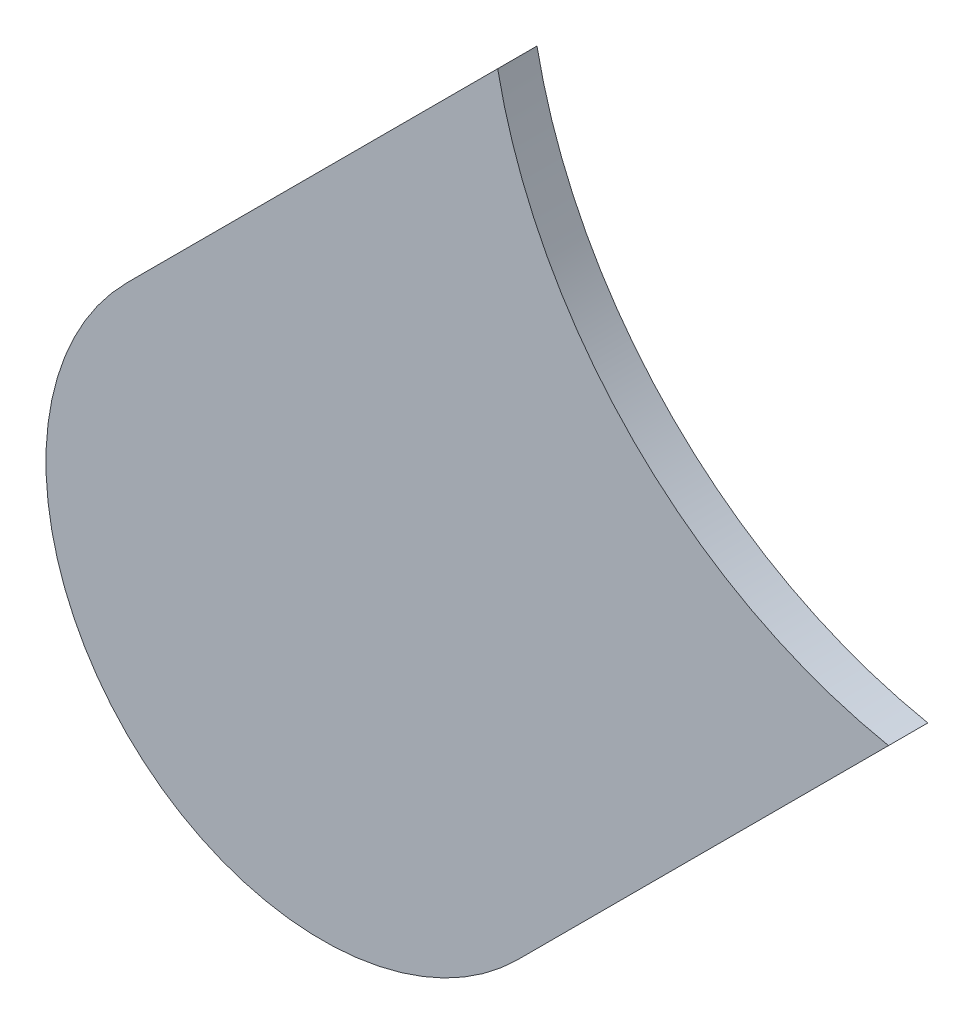
ISO-10303-21;
HEADER;
FILE_DESCRIPTION(('STEP AP214'),'2;1');
FILE_NAME('part.step','',(''),(''),'','','');
FILE_SCHEMA(('AUTOMOTIVE_DESIGN { 1 0 10303 214 1 1 1 1 }'));
ENDSEC;
DATA;
#1=APPLICATION_CONTEXT('core data for automotive mechanical design processes');
#2=APPLICATION_PROTOCOL_DEFINITION('international standard','automotive_design',2000,#1);
#3=PRODUCT_CONTEXT('',#1,'mechanical');
#4=PRODUCT('Part','Part','',(#3));
#5=PRODUCT_RELATED_PRODUCT_CATEGORY('part','',(#4));
#6=PRODUCT_DEFINITION_FORMATION('','',#4);
#7=PRODUCT_DEFINITION_CONTEXT('part definition',#1,'design');
#8=PRODUCT_DEFINITION('design','',#6,#7);
#9=PRODUCT_DEFINITION_SHAPE('','',#8);
#10=(LENGTH_UNIT() NAMED_UNIT(*) SI_UNIT(.MILLI.,.METRE.));
#11=(NAMED_UNIT(*) PLANE_ANGLE_UNIT() SI_UNIT($,.RADIAN.));
#12=(NAMED_UNIT(*) SI_UNIT($,.STERADIAN.) SOLID_ANGLE_UNIT());
#13=UNCERTAINTY_MEASURE_WITH_UNIT(LENGTH_MEASURE(1.E-05),#10,'distance_accuracy_value','');
#14=(GEOMETRIC_REPRESENTATION_CONTEXT(3) GLOBAL_UNCERTAINTY_ASSIGNED_CONTEXT((#13)) GLOBAL_UNIT_ASSIGNED_CONTEXT((#10,
#11,#12)) REPRESENTATION_CONTEXT('',''));
#15=CARTESIAN_POINT('',(0.,0.,0.));
#16=DIRECTION('',(0.,0.,1.));
#17=DIRECTION('',(1.,0.,0.));
#18=AXIS2_PLACEMENT_3D('',#15,#16,#17);
#19=CARTESIAN_POINT('',(108.89680024,115.72321788,0.));
#20=DIRECTION('',(-0.707106781186548,0.707106781186548,0.));
#21=DIRECTION('',(0.707106781186548,0.707106781186548,0.));
#22=AXIS2_PLACEMENT_3D('',#19,#20,#21);
#23=PLANE('',#22);
#24=DIRECTION('',(0.707106781186548,0.707106781186548,0.));
#25=VECTOR('',#24,1.);
#26=CARTESIAN_POINT('',(108.89680024,115.72321788,0.03556));
#27=LINE('',#26,#25);
#28=CARTESIAN_POINT('',(108.89680024,115.72321788,0.03556));
#29=VERTEX_POINT('',#28);
#30=CARTESIAN_POINT('',(109.232227003605,116.058644643605,0.03556));
#31=VERTEX_POINT('',#30);
#32=EDGE_CURVE('E11',#29,#31,#27,.T.);
#33=ORIENTED_EDGE('',*,*,#32,.F.);
#34=DIRECTION('',(0.,0.,1.));
#35=VECTOR('',#34,1.);
#36=CARTESIAN_POINT('',(108.89680024,115.72321788,0.));
#37=LINE('',#36,#35);
#38=CARTESIAN_POINT('',(108.89680024,115.72321788,0.));
#39=VERTEX_POINT('',#38);
#40=EDGE_CURVE('E24',#39,#29,#37,.T.);
#41=ORIENTED_EDGE('',*,*,#40,.F.);
#42=DIRECTION('',(0.707106781186548,0.707106781186548,0.));
#43=VECTOR('',#42,1.);
#44=CARTESIAN_POINT('',(108.89680024,115.72321788,0.));
#45=LINE('',#44,#43);
#46=CARTESIAN_POINT('',(109.232227003605,116.058644643605,0.));
#47=VERTEX_POINT('',#46);
#48=EDGE_CURVE('E75',#39,#47,#45,.T.);
#49=ORIENTED_EDGE('',*,*,#48,.T.);
#50=DIRECTION('',(0.,0.,1.));
#51=VECTOR('',#50,1.);
#52=CARTESIAN_POINT('',(109.232227003605,116.058644643605,0.));
#53=LINE('',#52,#51);
#54=EDGE_CURVE('E37',#47,#31,#53,.T.);
#55=ORIENTED_EDGE('',*,*,#54,.T.);
#56=EDGE_LOOP('',(#33,#41,#49,#55));
#57=FACE_BOUND('',#56,.T.);
#58=ADVANCED_FACE('F17',(#57),#23,.F.);
#59=CARTESIAN_POINT('',(109.3200252,116.4999956,0.));
#60=DIRECTION('',(0.,0.,-1.));
#61=DIRECTION('',(1.,0.,0.));
#62=AXIS2_PLACEMENT_3D('',#59,#60,#61);
#63=CYLINDRICAL_SURFACE('',#62,0.4499991);
#64=DIRECTION('',(0.,0.,1.));
#65=VECTOR('',#64,1.);
#66=CARTESIAN_POINT('',(108.878674243605,116.412197403605,0.));
#67=LINE('',#66,#65);
#68=CARTESIAN_POINT('',(108.878674243605,116.412197403605,0.));
#69=VERTEX_POINT('',#68);
#70=CARTESIAN_POINT('',(108.878674243605,116.412197403605,0.03556));
#71=VERTEX_POINT('',#70);
#72=EDGE_CURVE('E67',#69,#71,#67,.T.);
#73=ORIENTED_EDGE('',*,*,#72,.T.);
#74=CARTESIAN_POINT('',(109.3200252,116.4999956,0.03556));
#75=DIRECTION('',(0.,0.,1.));
#76=DIRECTION('',(1.,0.,0.));
#77=AXIS2_PLACEMENT_3D('',#74,#75,#76);
#78=CIRCLE('',#77,0.4499991);
#79=EDGE_CURVE('E82',#71,#31,#78,.T.);
#80=ORIENTED_EDGE('',*,*,#79,.T.);
#81=ORIENTED_EDGE('',*,*,#54,.F.);
#82=CARTESIAN_POINT('',(109.3200252,116.4999956,0.));
#83=DIRECTION('',(0.,0.,1.));
#84=DIRECTION('',(1.,0.,0.));
#85=AXIS2_PLACEMENT_3D('',#82,#83,#84);
#86=CIRCLE('',#85,0.4499991);
#87=EDGE_CURVE('E80',#69,#47,#86,.T.);
#88=ORIENTED_EDGE('',*,*,#87,.F.);
#89=EDGE_LOOP('',(#73,#80,#81,#88));
#90=FACE_BOUND('',#89,.T.);
#91=ADVANCED_FACE('F88',(#90),#63,.F.);
#92=CARTESIAN_POINT('',(108.878674243605,116.412197403605,0.));
#93=DIRECTION('',(0.707106781186531,-0.707106781186564,0.));
#94=DIRECTION('',(-0.707106781186564,-0.707106781186531,0.));
#95=AXIS2_PLACEMENT_3D('',#92,#93,#94);
#96=PLANE('',#95);
#97=DIRECTION('',(-0.707106781186564,-0.707106781186531,0.));
#98=VECTOR('',#97,1.);
#99=CARTESIAN_POINT('',(109.14324882,116.67677198,0.03556));
#100=LINE('',#99,#98);
#101=CARTESIAN_POINT('',(108.54324748,116.07677064,0.03556));
#102=VERTEX_POINT('',#101);
#103=EDGE_CURVE('E71',#71,#102,#100,.T.);
#104=ORIENTED_EDGE('',*,*,#103,.F.);
#105=ORIENTED_EDGE('',*,*,#72,.F.);
#106=DIRECTION('',(-0.707106781186564,-0.707106781186531,0.));
#107=VECTOR('',#106,1.);
#108=CARTESIAN_POINT('',(109.14324882,116.67677198,0.));
#109=LINE('',#108,#107);
#110=CARTESIAN_POINT('',(108.54324748,116.07677064,0.));
#111=VERTEX_POINT('',#110);
#112=EDGE_CURVE('E63',#69,#111,#109,.T.);
#113=ORIENTED_EDGE('',*,*,#112,.T.);
#114=DIRECTION('',(0.,0.,1.));
#115=VECTOR('',#114,1.);
#116=CARTESIAN_POINT('',(108.54324748,116.07677064,0.));
#117=LINE('',#116,#115);
#118=EDGE_CURVE('E53',#111,#102,#117,.T.);
#119=ORIENTED_EDGE('',*,*,#118,.T.);
#120=EDGE_LOOP('',(#104,#105,#113,#119));
#121=FACE_BOUND('',#120,.T.);
#122=ADVANCED_FACE('F66',(#121),#96,.F.);
#123=CARTESIAN_POINT('',(108.72002386,115.89999426,0.));
#124=DIRECTION('',(0.,0.,-1.));
#125=DIRECTION('',(-0.707106781186548,0.707106781186548,0.));
#126=AXIS2_PLACEMENT_3D('',#123,#124,#125);
#127=CYLINDRICAL_SURFACE('',#126,0.249999554103226);
#128=CARTESIAN_POINT('',(108.72002386,115.89999426,0.03556));
#129=DIRECTION('',(0.,0.,1.));
#130=DIRECTION('',(-0.707106781186548,0.707106781186548,0.));
#131=AXIS2_PLACEMENT_3D('',#128,#129,#130);
#132=CIRCLE('',#131,0.249999554103226);
#133=EDGE_CURVE('E59',#102,#29,#132,.T.);
#134=ORIENTED_EDGE('',*,*,#133,.F.);
#135=ORIENTED_EDGE('',*,*,#118,.F.);
#136=CARTESIAN_POINT('',(108.72002386,115.89999426,0.));
#137=DIRECTION('',(0.,0.,1.));
#138=DIRECTION('',(-0.707106781186548,0.707106781186548,0.));
#139=AXIS2_PLACEMENT_3D('',#136,#137,#138);
#140=CIRCLE('',#139,0.249999554103226);
#141=EDGE_CURVE('E57',#111,#39,#140,.T.);
#142=ORIENTED_EDGE('',*,*,#141,.T.);
#143=ORIENTED_EDGE('',*,*,#40,.T.);
#144=EDGE_LOOP('',(#134,#135,#142,#143));
#145=FACE_BOUND('',#144,.T.);
#146=ADVANCED_FACE('F55',(#145),#127,.T.);
#147=CARTESIAN_POINT('',(108.89680024,115.72321788,0.));
#148=DIRECTION('',(0.,0.,-1.));
#149=DIRECTION('',(-1.,0.,0.));
#150=AXIS2_PLACEMENT_3D('',#147,#148,#149);
#151=PLANE('',#150);
#152=ORIENTED_EDGE('',*,*,#48,.F.);
#153=ORIENTED_EDGE('',*,*,#141,.F.);
#154=ORIENTED_EDGE('',*,*,#112,.F.);
#155=ORIENTED_EDGE('',*,*,#87,.T.);
#156=EDGE_LOOP('',(#152,#153,#154,#155));
#157=FACE_BOUND('',#156,.T.);
#158=ADVANCED_FACE('F74',(#157),#151,.T.);
#159=CARTESIAN_POINT('',(108.89680024,115.72321788,0.03556));
#160=DIRECTION('',(0.,0.,-1.));
#161=DIRECTION('',(-1.,0.,0.));
#162=AXIS2_PLACEMENT_3D('',#159,#160,#161);
#163=PLANE('',#162);
#164=ORIENTED_EDGE('',*,*,#133,.T.);
#165=ORIENTED_EDGE('',*,*,#32,.T.);
#166=ORIENTED_EDGE('',*,*,#79,.F.);
#167=ORIENTED_EDGE('',*,*,#103,.T.);
#168=EDGE_LOOP('',(#164,#165,#166,#167));
#169=FACE_BOUND('',#168,.T.);
#170=ADVANCED_FACE('F91',(#169),#163,.F.);
#171=CLOSED_SHELL('',(#58,#91,#122,#146,#158,#170));
#172=MANIFOLD_SOLID_BREP('B1',#171);
#173=ADVANCED_BREP_SHAPE_REPRESENTATION('',(#18,#172),#14);
#174=SHAPE_DEFINITION_REPRESENTATION(#9,#173);
ENDSEC;
END-ISO-10303-21;
